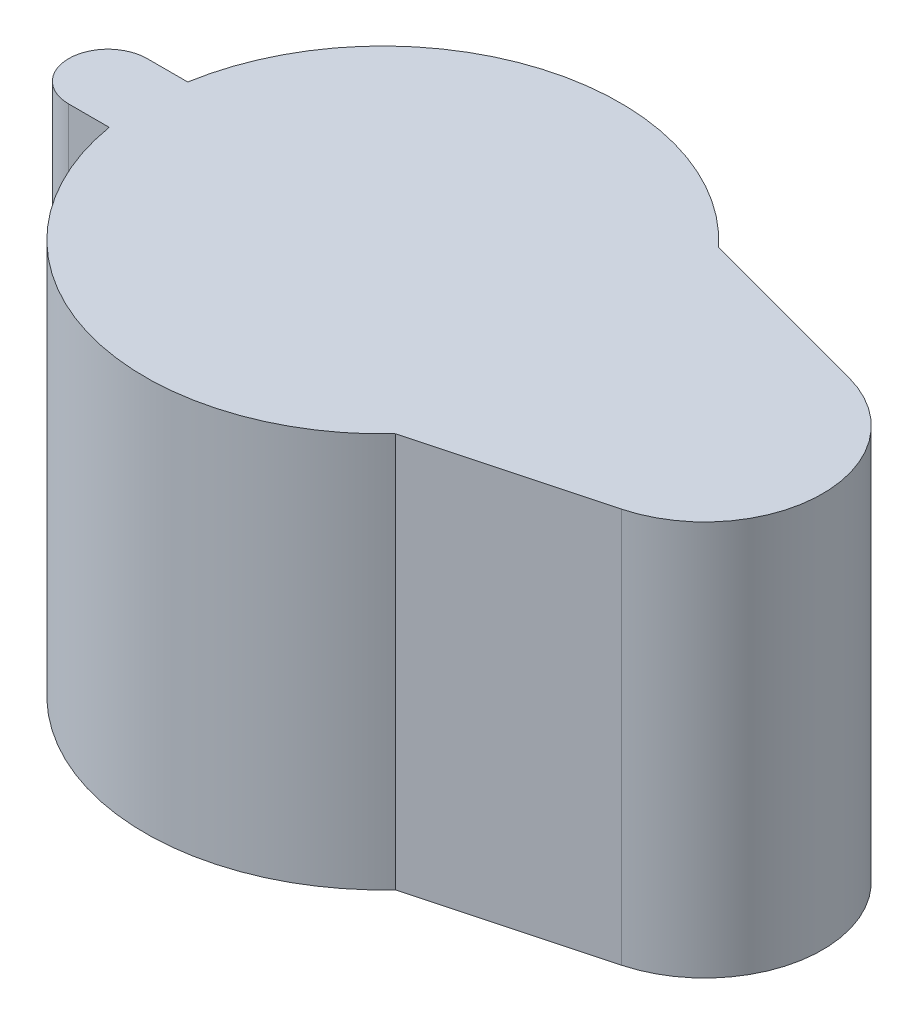
ISO-10303-21;
HEADER;
FILE_DESCRIPTION(('STEP AP214'),'2;1');
FILE_NAME('part.step','',(''),(''),'','','');
FILE_SCHEMA(('AUTOMOTIVE_DESIGN { 1 0 10303 214 1 1 1 1 }'));
ENDSEC;
DATA;
#1=APPLICATION_CONTEXT('core data for automotive mechanical design processes');
#2=APPLICATION_PROTOCOL_DEFINITION('international standard','automotive_design',2000,#1);
#3=PRODUCT_CONTEXT('',#1,'mechanical');
#4=PRODUCT('Part','Part','',(#3));
#5=PRODUCT_RELATED_PRODUCT_CATEGORY('part','',(#4));
#6=PRODUCT_DEFINITION_FORMATION('','',#4);
#7=PRODUCT_DEFINITION_CONTEXT('part definition',#1,'design');
#8=PRODUCT_DEFINITION('design','',#6,#7);
#9=PRODUCT_DEFINITION_SHAPE('','',#8);
#10=(LENGTH_UNIT() NAMED_UNIT(*) SI_UNIT(.MILLI.,.METRE.));
#11=(NAMED_UNIT(*) PLANE_ANGLE_UNIT() SI_UNIT($,.RADIAN.));
#12=(NAMED_UNIT(*) SI_UNIT($,.STERADIAN.) SOLID_ANGLE_UNIT());
#13=UNCERTAINTY_MEASURE_WITH_UNIT(LENGTH_MEASURE(1.E-05),#10,'distance_accuracy_value','');
#14=(GEOMETRIC_REPRESENTATION_CONTEXT(3) GLOBAL_UNCERTAINTY_ASSIGNED_CONTEXT((#13)) GLOBAL_UNIT_ASSIGNED_CONTEXT((#10,
#11,#12)) REPRESENTATION_CONTEXT('',''));
#15=CARTESIAN_POINT('',(0.,0.,0.));
#16=DIRECTION('',(0.,0.,1.));
#17=DIRECTION('',(1.,0.,0.));
#18=AXIS2_PLACEMENT_3D('',#15,#16,#17);
#19=CARTESIAN_POINT('',(41.,50.3,0.));
#20=DIRECTION('',(0.,-1.,0.));
#21=DIRECTION('',(0.,0.,-1.));
#22=AXIS2_PLACEMENT_3D('',#19,#20,#21);
#23=CYLINDRICAL_SURFACE('',#22,15.);
#24=CARTESIAN_POINT('',(41.,0.,0.));
#25=DIRECTION('',(0.,1.,0.));
#26=DIRECTION('',(0.,0.,1.));
#27=AXIS2_PLACEMENT_3D('',#24,#25,#26);
#28=CIRCLE('',#27,15.);
#29=CARTESIAN_POINT('',(44.8822856765378,0.,14.488887394336));
#30=VERTEX_POINT('',#29);
#31=CARTESIAN_POINT('',(44.8822856765378,0.,-14.488887394336));
#32=VERTEX_POINT('',#31);
#33=EDGE_CURVE('E140',#30,#32,#28,.T.);
#34=ORIENTED_EDGE('',*,*,#33,.T.);
#35=DIRECTION('',(0.,-1.,0.));
#36=VECTOR('',#35,1.);
#37=CARTESIAN_POINT('',(44.8822856765378,50.3,-14.488887394336));
#38=LINE('',#37,#36);
#39=CARTESIAN_POINT('',(44.8822856765378,50.3,-14.488887394336));
#40=VERTEX_POINT('',#39);
#41=EDGE_CURVE('E11',#40,#32,#38,.T.);
#42=ORIENTED_EDGE('',*,*,#41,.F.);
#43=CARTESIAN_POINT('',(41.,50.3,0.));
#44=DIRECTION('',(0.,1.,0.));
#45=DIRECTION('',(0.,0.,1.));
#46=AXIS2_PLACEMENT_3D('',#43,#44,#45);
#47=CIRCLE('',#46,15.);
#48=CARTESIAN_POINT('',(44.8822856765378,50.3,14.488887394336));
#49=VERTEX_POINT('',#48);
#50=EDGE_CURVE('E162',#49,#40,#47,.T.);
#51=ORIENTED_EDGE('',*,*,#50,.F.);
#52=DIRECTION('',(0.,-1.,0.));
#53=VECTOR('',#52,1.);
#54=CARTESIAN_POINT('',(44.8822856765378,50.3,14.488887394336));
#55=LINE('',#54,#53);
#56=EDGE_CURVE('E136',#49,#30,#55,.T.);
#57=ORIENTED_EDGE('',*,*,#56,.T.);
#58=EDGE_LOOP('',(#34,#42,#51,#57));
#59=FACE_BOUND('',#58,.T.);
#60=ADVANCED_FACE('F39',(#59),#23,.T.);
#61=CARTESIAN_POINT('',(44.8822856765378,50.3,-14.488887394336));
#62=DIRECTION('',(-0.258819045102521,0.,0.965925826289068));
#63=DIRECTION('',(0.965925826289068,0.,0.258819045102521));
#64=AXIS2_PLACEMENT_3D('',#61,#62,#63);
#65=PLANE('',#64);
#66=DIRECTION('',(-0.965925826289068,0.,-0.258819045102521));
#67=VECTOR('',#66,1.);
#68=CARTESIAN_POINT('',(44.8822856765378,0.,-14.488887394336));
#69=LINE('',#68,#67);
#70=CARTESIAN_POINT('',(22.177153433323,0.,-20.5727092429473));
#71=VERTEX_POINT('',#70);
#72=EDGE_CURVE('E144',#32,#71,#69,.T.);
#73=ORIENTED_EDGE('',*,*,#72,.T.);
#74=DIRECTION('',(0.,-1.,0.));
#75=VECTOR('',#74,1.);
#76=CARTESIAN_POINT('',(22.177153433323,50.3,-20.5727092429473));
#77=LINE('',#76,#75);
#78=CARTESIAN_POINT('',(22.177153433323,50.3,-20.5727092429473));
#79=VERTEX_POINT('',#78);
#80=EDGE_CURVE('E48',#79,#71,#77,.T.);
#81=ORIENTED_EDGE('',*,*,#80,.F.);
#82=DIRECTION('',(-0.965925826289068,0.,-0.258819045102521));
#83=VECTOR('',#82,1.);
#84=CARTESIAN_POINT('',(44.8822856765378,50.3,-14.488887394336));
#85=LINE('',#84,#83);
#86=EDGE_CURVE('E99',#40,#79,#85,.T.);
#87=ORIENTED_EDGE('',*,*,#86,.F.);
#88=ORIENTED_EDGE('',*,*,#41,.T.);
#89=EDGE_LOOP('',(#73,#81,#87,#88));
#90=FACE_BOUND('',#89,.T.);
#91=ADVANCED_FACE('F208',(#90),#65,.F.);
#92=CARTESIAN_POINT('',(0.,50.3,0.));
#93=DIRECTION('',(0.,-1.,0.));
#94=DIRECTION('',(0.,0.,-1.));
#95=AXIS2_PLACEMENT_3D('',#92,#93,#94);
#96=CYLINDRICAL_SURFACE('',#95,30.25);
#97=CARTESIAN_POINT('',(0.,0.,0.));
#98=DIRECTION('',(0.,1.,0.));
#99=DIRECTION('',(0.,0.,1.));
#100=AXIS2_PLACEMENT_3D('',#97,#98,#99);
#101=CIRCLE('',#100,30.25);
#102=CARTESIAN_POINT('',(-29.833915264343,0.,-5.00000000000001));
#103=VERTEX_POINT('',#102);
#104=EDGE_CURVE('E147',#71,#103,#101,.T.);
#105=ORIENTED_EDGE('',*,*,#104,.T.);
#106=DIRECTION('',(0.,-1.,0.));
#107=VECTOR('',#106,1.);
#108=CARTESIAN_POINT('',(-29.833915264343,50.3,-5.00000000000001));
#109=LINE('',#108,#107);
#110=CARTESIAN_POINT('',(-29.833915264343,50.3,-5.00000000000001));
#111=VERTEX_POINT('',#110);
#112=EDGE_CURVE('E173',#111,#103,#109,.T.);
#113=ORIENTED_EDGE('',*,*,#112,.F.);
#114=CARTESIAN_POINT('',(0.,50.3,0.));
#115=DIRECTION('',(0.,1.,0.));
#116=DIRECTION('',(0.,0.,1.));
#117=AXIS2_PLACEMENT_3D('',#114,#115,#116);
#118=CIRCLE('',#117,30.25);
#119=EDGE_CURVE('E183',#79,#111,#118,.T.);
#120=ORIENTED_EDGE('',*,*,#119,.F.);
#121=ORIENTED_EDGE('',*,*,#80,.T.);
#122=EDGE_LOOP('',(#105,#113,#120,#121));
#123=FACE_BOUND('',#122,.T.);
#124=ADVANCED_FACE('F181',(#123),#96,.T.);
#125=CARTESIAN_POINT('',(-35.,50.3,-5.));
#126=DIRECTION('',(0.,0.,1.));
#127=DIRECTION('',(1.,0.,0.));
#128=AXIS2_PLACEMENT_3D('',#125,#126,#127);
#129=PLANE('',#128);
#130=DIRECTION('',(-1.,0.,0.));
#131=VECTOR('',#130,1.);
#132=CARTESIAN_POINT('',(-35.,0.,-5.));
#133=LINE('',#132,#131);
#134=CARTESIAN_POINT('',(-35.,0.,-5.));
#135=VERTEX_POINT('',#134);
#136=EDGE_CURVE('E150',#103,#135,#133,.T.);
#137=ORIENTED_EDGE('',*,*,#136,.T.);
#138=DIRECTION('',(0.,-1.,0.));
#139=VECTOR('',#138,1.);
#140=CARTESIAN_POINT('',(-35.,50.3,-5.));
#141=LINE('',#140,#139);
#142=CARTESIAN_POINT('',(-35.,50.3,-5.));
#143=VERTEX_POINT('',#142);
#144=EDGE_CURVE('E169',#143,#135,#141,.T.);
#145=ORIENTED_EDGE('',*,*,#144,.F.);
#146=DIRECTION('',(-1.,0.,0.));
#147=VECTOR('',#146,1.);
#148=CARTESIAN_POINT('',(-35.,50.3,-5.));
#149=LINE('',#148,#147);
#150=EDGE_CURVE('E196',#111,#143,#149,.T.);
#151=ORIENTED_EDGE('',*,*,#150,.F.);
#152=ORIENTED_EDGE('',*,*,#112,.T.);
#153=EDGE_LOOP('',(#137,#145,#151,#152));
#154=FACE_BOUND('',#153,.T.);
#155=ADVANCED_FACE('F191',(#154),#129,.F.);
#156=CARTESIAN_POINT('',(-35.,50.3,0.));
#157=DIRECTION('',(0.,-1.,0.));
#158=DIRECTION('',(0.,0.,-1.));
#159=AXIS2_PLACEMENT_3D('',#156,#157,#158);
#160=CYLINDRICAL_SURFACE('',#159,5.);
#161=CARTESIAN_POINT('',(-35.,0.,0.));
#162=DIRECTION('',(0.,1.,0.));
#163=DIRECTION('',(0.,0.,1.));
#164=AXIS2_PLACEMENT_3D('',#161,#162,#163);
#165=CIRCLE('',#164,5.);
#166=CARTESIAN_POINT('',(-35.,0.,5.00000000000001));
#167=VERTEX_POINT('',#166);
#168=EDGE_CURVE('E153',#135,#167,#165,.T.);
#169=ORIENTED_EDGE('',*,*,#168,.T.);
#170=DIRECTION('',(0.,-1.,0.));
#171=VECTOR('',#170,1.);
#172=CARTESIAN_POINT('',(-35.,50.3,5.00000000000001));
#173=LINE('',#172,#171);
#174=CARTESIAN_POINT('',(-35.,50.3,5.00000000000001));
#175=VERTEX_POINT('',#174);
#176=EDGE_CURVE('E129',#175,#167,#173,.T.);
#177=ORIENTED_EDGE('',*,*,#176,.F.);
#178=CARTESIAN_POINT('',(-35.,50.3,0.));
#179=DIRECTION('',(0.,1.,0.));
#180=DIRECTION('',(0.,0.,1.));
#181=AXIS2_PLACEMENT_3D('',#178,#179,#180);
#182=CIRCLE('',#181,5.);
#183=EDGE_CURVE('E118',#143,#175,#182,.T.);
#184=ORIENTED_EDGE('',*,*,#183,.F.);
#185=ORIENTED_EDGE('',*,*,#144,.T.);
#186=EDGE_LOOP('',(#169,#177,#184,#185));
#187=FACE_BOUND('',#186,.T.);
#188=ADVANCED_FACE('F194',(#187),#160,.T.);
#189=CARTESIAN_POINT('',(-35.,50.3,5.));
#190=DIRECTION('',(0.,0.,-1.));
#191=DIRECTION('',(-1.,0.,0.));
#192=AXIS2_PLACEMENT_3D('',#189,#190,#191);
#193=PLANE('',#192);
#194=DIRECTION('',(1.,0.,0.));
#195=VECTOR('',#194,1.);
#196=CARTESIAN_POINT('',(-35.,0.,5.));
#197=LINE('',#196,#195);
#198=CARTESIAN_POINT('',(-29.833915264343,0.,5.00000000000001));
#199=VERTEX_POINT('',#198);
#200=EDGE_CURVE('E127',#167,#199,#197,.T.);
#201=ORIENTED_EDGE('',*,*,#200,.T.);
#202=DIRECTION('',(0.,-1.,0.));
#203=VECTOR('',#202,1.);
#204=CARTESIAN_POINT('',(-29.833915264343,50.3,5.00000000000001));
#205=LINE('',#204,#203);
#206=CARTESIAN_POINT('',(-29.833915264343,50.3,5.00000000000001));
#207=VERTEX_POINT('',#206);
#208=EDGE_CURVE('E124',#207,#199,#205,.T.);
#209=ORIENTED_EDGE('',*,*,#208,.F.);
#210=DIRECTION('',(1.,0.,0.));
#211=VECTOR('',#210,1.);
#212=CARTESIAN_POINT('',(-35.,50.3,5.));
#213=LINE('',#212,#211);
#214=EDGE_CURVE('E112',#175,#207,#213,.T.);
#215=ORIENTED_EDGE('',*,*,#214,.F.);
#216=ORIENTED_EDGE('',*,*,#176,.T.);
#217=EDGE_LOOP('',(#201,#209,#215,#216));
#218=FACE_BOUND('',#217,.T.);
#219=ADVANCED_FACE('F125',(#218),#193,.F.);
#220=CARTESIAN_POINT('',(0.,50.3,0.));
#221=DIRECTION('',(0.,-1.,0.));
#222=DIRECTION('',(0.,0.,-1.));
#223=AXIS2_PLACEMENT_3D('',#220,#221,#222);
#224=CYLINDRICAL_SURFACE('',#223,30.25);
#225=CARTESIAN_POINT('',(0.,0.,0.));
#226=DIRECTION('',(0.,1.,0.));
#227=DIRECTION('',(0.,0.,1.));
#228=AXIS2_PLACEMENT_3D('',#225,#226,#227);
#229=CIRCLE('',#228,30.25);
#230=CARTESIAN_POINT('',(22.177153433323,0.,20.5727092429473));
#231=VERTEX_POINT('',#230);
#232=EDGE_CURVE('E85',#199,#231,#229,.T.);
#233=ORIENTED_EDGE('',*,*,#232,.T.);
#234=DIRECTION('',(0.,-1.,0.));
#235=VECTOR('',#234,1.);
#236=CARTESIAN_POINT('',(22.177153433323,50.3,20.5727092429473));
#237=LINE('',#236,#235);
#238=CARTESIAN_POINT('',(22.177153433323,50.3,20.5727092429473));
#239=VERTEX_POINT('',#238);
#240=EDGE_CURVE('E130',#239,#231,#237,.T.);
#241=ORIENTED_EDGE('',*,*,#240,.F.);
#242=CARTESIAN_POINT('',(0.,50.3,0.));
#243=DIRECTION('',(0.,1.,0.));
#244=DIRECTION('',(0.,0.,1.));
#245=AXIS2_PLACEMENT_3D('',#242,#243,#244);
#246=CIRCLE('',#245,30.25);
#247=EDGE_CURVE('E116',#207,#239,#246,.T.);
#248=ORIENTED_EDGE('',*,*,#247,.F.);
#249=ORIENTED_EDGE('',*,*,#208,.T.);
#250=EDGE_LOOP('',(#233,#241,#248,#249));
#251=FACE_BOUND('',#250,.T.);
#252=ADVANCED_FACE('F132',(#251),#224,.T.);
#253=CARTESIAN_POINT('',(44.8822856765378,50.3,14.488887394336));
#254=DIRECTION('',(-0.258819045102522,0.,-0.965925826289068));
#255=DIRECTION('',(-0.965925826289068,0.,0.258819045102522));
#256=AXIS2_PLACEMENT_3D('',#253,#254,#255);
#257=PLANE('',#256);
#258=DIRECTION('',(0.965925826289068,0.,-0.258819045102522));
#259=VECTOR('',#258,1.);
#260=CARTESIAN_POINT('',(44.8822856765378,0.,14.488887394336));
#261=LINE('',#260,#259);
#262=EDGE_CURVE('E91',#231,#30,#261,.T.);
#263=ORIENTED_EDGE('',*,*,#262,.T.);
#264=ORIENTED_EDGE('',*,*,#56,.F.);
#265=DIRECTION('',(0.965925826289068,0.,-0.258819045102522));
#266=VECTOR('',#265,1.);
#267=CARTESIAN_POINT('',(44.8822856765378,50.3,14.488887394336));
#268=LINE('',#267,#266);
#269=EDGE_CURVE('E56',#239,#49,#268,.T.);
#270=ORIENTED_EDGE('',*,*,#269,.F.);
#271=ORIENTED_EDGE('',*,*,#240,.T.);
#272=EDGE_LOOP('',(#263,#264,#270,#271));
#273=FACE_BOUND('',#272,.T.);
#274=ADVANCED_FACE('F224',(#273),#257,.F.);
#275=CARTESIAN_POINT('',(41.,50.3,0.));
#276=DIRECTION('',(0.,1.,0.));
#277=DIRECTION('',(0.,0.,1.));
#278=AXIS2_PLACEMENT_3D('',#275,#276,#277);
#279=PLANE('',#278);
#280=ORIENTED_EDGE('',*,*,#50,.T.);
#281=ORIENTED_EDGE('',*,*,#86,.T.);
#282=ORIENTED_EDGE('',*,*,#119,.T.);
#283=ORIENTED_EDGE('',*,*,#150,.T.);
#284=ORIENTED_EDGE('',*,*,#183,.T.);
#285=ORIENTED_EDGE('',*,*,#214,.T.);
#286=ORIENTED_EDGE('',*,*,#247,.T.);
#287=ORIENTED_EDGE('',*,*,#269,.T.);
#288=EDGE_LOOP('',(#280,#281,#282,#283,#284,#285,#286,#287));
#289=FACE_BOUND('',#288,.T.);
#290=ADVANCED_FACE('F114',(#289),#279,.T.);
#291=CARTESIAN_POINT('',(41.,0.,0.));
#292=DIRECTION('',(0.,1.,0.));
#293=DIRECTION('',(0.,0.,1.));
#294=AXIS2_PLACEMENT_3D('',#291,#292,#293);
#295=PLANE('',#294);
#296=ORIENTED_EDGE('',*,*,#33,.F.);
#297=ORIENTED_EDGE('',*,*,#262,.F.);
#298=ORIENTED_EDGE('',*,*,#232,.F.);
#299=ORIENTED_EDGE('',*,*,#200,.F.);
#300=ORIENTED_EDGE('',*,*,#168,.F.);
#301=ORIENTED_EDGE('',*,*,#136,.F.);
#302=ORIENTED_EDGE('',*,*,#104,.F.);
#303=ORIENTED_EDGE('',*,*,#72,.F.);
#304=EDGE_LOOP('',(#296,#297,#298,#299,#300,#301,#302,#303));
#305=FACE_BOUND('',#304,.T.);
#306=ADVANCED_FACE('F187',(#305),#295,.F.);
#307=CLOSED_SHELL('',(#60,#91,#124,#155,#188,#219,#252,#274,#290,#306));
#308=MANIFOLD_SOLID_BREP('B2',#307);
#309=ADVANCED_BREP_SHAPE_REPRESENTATION('',(#18,#308),#14);
#310=SHAPE_DEFINITION_REPRESENTATION(#9,#309);
ENDSEC;
END-ISO-10303-21;
